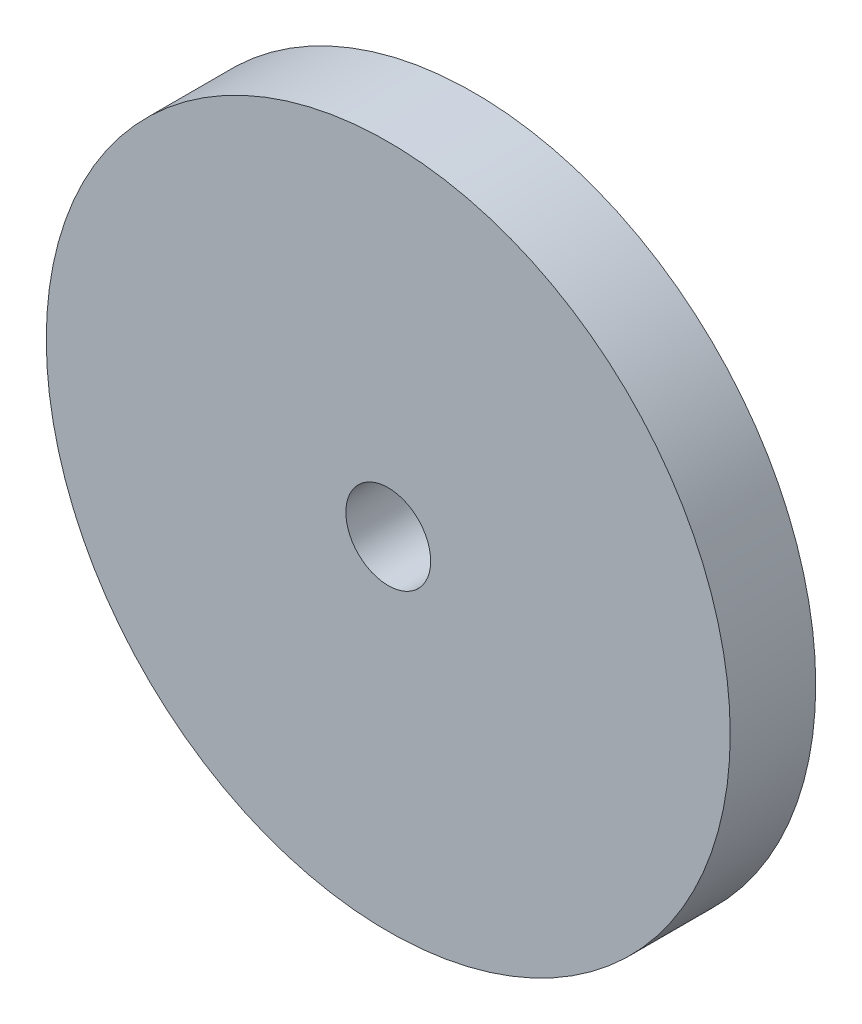
ISO-10303-21;
HEADER;
FILE_DESCRIPTION(('STEP AP214'),'2;1');
FILE_NAME('part.step','',(''),(''),'','','');
FILE_SCHEMA(('AUTOMOTIVE_DESIGN { 1 0 10303 214 1 1 1 1 }'));
ENDSEC;
DATA;
#1=APPLICATION_CONTEXT('core data for automotive mechanical design processes');
#2=APPLICATION_PROTOCOL_DEFINITION('international standard','automotive_design',2000,#1);
#3=PRODUCT_CONTEXT('',#1,'mechanical');
#4=PRODUCT('Part','Part','',(#3));
#5=PRODUCT_RELATED_PRODUCT_CATEGORY('part','',(#4));
#6=PRODUCT_DEFINITION_FORMATION('','',#4);
#7=PRODUCT_DEFINITION_CONTEXT('part definition',#1,'design');
#8=PRODUCT_DEFINITION('design','',#6,#7);
#9=PRODUCT_DEFINITION_SHAPE('','',#8);
#10=(LENGTH_UNIT() NAMED_UNIT(*) SI_UNIT(.MILLI.,.METRE.));
#11=(NAMED_UNIT(*) PLANE_ANGLE_UNIT() SI_UNIT($,.RADIAN.));
#12=(NAMED_UNIT(*) SI_UNIT($,.STERADIAN.) SOLID_ANGLE_UNIT());
#13=UNCERTAINTY_MEASURE_WITH_UNIT(LENGTH_MEASURE(1.E-05),#10,'distance_accuracy_value','');
#14=(GEOMETRIC_REPRESENTATION_CONTEXT(3) GLOBAL_UNCERTAINTY_ASSIGNED_CONTEXT((#13)) GLOBAL_UNIT_ASSIGNED_CONTEXT((#10,
#11,#12)) REPRESENTATION_CONTEXT('',''));
#15=CARTESIAN_POINT('',(0.,0.,0.));
#16=DIRECTION('',(0.,0.,1.));
#17=DIRECTION('',(1.,0.,0.));
#18=AXIS2_PLACEMENT_3D('',#15,#16,#17);
#19=CARTESIAN_POINT('',(0.,0.,6.35));
#20=DIRECTION('',(0.,0.,1.));
#21=DIRECTION('',(1.,0.,0.));
#22=AXIS2_PLACEMENT_3D('',#19,#20,#21);
#23=PLANE('',#22);
#24=CARTESIAN_POINT('',(0.,0.,6.35));
#25=DIRECTION('',(0.,0.,1.));
#26=DIRECTION('',(1.,0.,0.));
#27=AXIS2_PLACEMENT_3D('',#24,#25,#26);
#28=CIRCLE('',#27,25.4);
#29=CARTESIAN_POINT('',(25.4,0.,6.35));
#30=VERTEX_POINT('',#29);
#31=EDGE_CURVE('E10',#30,#30,#28,.T.);
#32=ORIENTED_EDGE('',*,*,#31,.T.);
#33=EDGE_LOOP('',(#32));
#34=FACE_BOUND('',#33,.T.);
#35=CARTESIAN_POINT('',(0.,0.,6.35));
#36=DIRECTION('',(0.,0.,1.));
#37=DIRECTION('',(1.,0.,0.));
#38=AXIS2_PLACEMENT_3D('',#35,#36,#37);
#39=CIRCLE('',#38,3.1496);
#40=CARTESIAN_POINT('',(3.1496,0.,6.35));
#41=VERTEX_POINT('',#40);
#42=EDGE_CURVE('E50',#41,#41,#39,.T.);
#43=ORIENTED_EDGE('',*,*,#42,.F.);
#44=EDGE_LOOP('',(#43));
#45=FACE_BOUND('',#44,.T.);
#46=ADVANCED_FACE('F37',(#34,#45),#23,.T.);
#47=CARTESIAN_POINT('',(0.,0.,0.));
#48=DIRECTION('',(0.,0.,1.));
#49=DIRECTION('',(1.,0.,0.));
#50=AXIS2_PLACEMENT_3D('',#47,#48,#49);
#51=PLANE('',#50);
#52=CARTESIAN_POINT('',(0.,0.,0.));
#53=DIRECTION('',(0.,0.,1.));
#54=DIRECTION('',(1.,0.,0.));
#55=AXIS2_PLACEMENT_3D('',#52,#53,#54);
#56=CIRCLE('',#55,25.4);
#57=CARTESIAN_POINT('',(25.4,0.,0.));
#58=VERTEX_POINT('',#57);
#59=EDGE_CURVE('E41',#58,#58,#56,.T.);
#60=ORIENTED_EDGE('',*,*,#59,.F.);
#61=EDGE_LOOP('',(#60));
#62=FACE_BOUND('',#61,.T.);
#63=CARTESIAN_POINT('',(0.,0.,0.));
#64=DIRECTION('',(0.,0.,1.));
#65=DIRECTION('',(1.,0.,0.));
#66=AXIS2_PLACEMENT_3D('',#63,#64,#65);
#67=CIRCLE('',#66,3.1496);
#68=CARTESIAN_POINT('',(3.1496,0.,0.));
#69=VERTEX_POINT('',#68);
#70=EDGE_CURVE('E52',#69,#69,#67,.T.);
#71=ORIENTED_EDGE('',*,*,#70,.T.);
#72=EDGE_LOOP('',(#71));
#73=FACE_BOUND('',#72,.T.);
#74=ADVANCED_FACE('F64',(#62,#73),#51,.F.);
#75=CARTESIAN_POINT('',(0.,0.,6.35));
#76=DIRECTION('',(0.,0.,-1.));
#77=DIRECTION('',(-1.,0.,0.));
#78=AXIS2_PLACEMENT_3D('',#75,#76,#77);
#79=CYLINDRICAL_SURFACE('',#78,25.4);
#80=ORIENTED_EDGE('',*,*,#31,.F.);
#81=EDGE_LOOP('',(#80));
#82=FACE_BOUND('',#81,.T.);
#83=ORIENTED_EDGE('',*,*,#59,.T.);
#84=EDGE_LOOP('',(#83));
#85=FACE_BOUND('',#84,.T.);
#86=ADVANCED_FACE('F39',(#82,#85),#79,.T.);
#87=CARTESIAN_POINT('',(0.,0.,6.35));
#88=DIRECTION('',(0.,0.,-1.));
#89=DIRECTION('',(-1.,0.,0.));
#90=AXIS2_PLACEMENT_3D('',#87,#88,#89);
#91=CYLINDRICAL_SURFACE('',#90,3.1496);
#92=ORIENTED_EDGE('',*,*,#42,.T.);
#93=EDGE_LOOP('',(#92));
#94=FACE_BOUND('',#93,.T.);
#95=ORIENTED_EDGE('',*,*,#70,.F.);
#96=EDGE_LOOP('',(#95));
#97=FACE_BOUND('',#96,.T.);
#98=ADVANCED_FACE('F60',(#94,#97),#91,.F.);
#99=CLOSED_SHELL('',(#46,#74,#86,#98));
#100=MANIFOLD_SOLID_BREP('B2',#99);
#101=ADVANCED_BREP_SHAPE_REPRESENTATION('',(#18,#100),#14);
#102=SHAPE_DEFINITION_REPRESENTATION(#9,#101);
ENDSEC;
END-ISO-10303-21;
